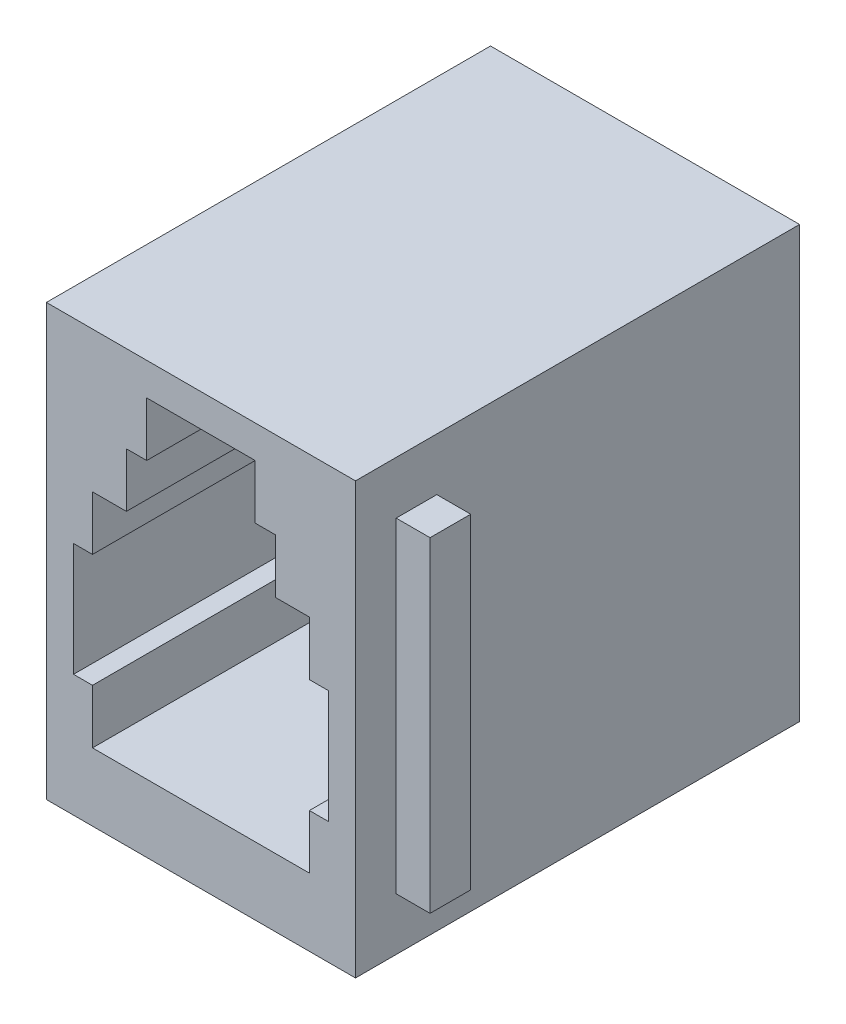
ISO-10303-21;
HEADER;
FILE_DESCRIPTION(('STEP AP214'),'2;1');
FILE_NAME('part.step','',(''),(''),'','','');
FILE_SCHEMA(('AUTOMOTIVE_DESIGN { 1 0 10303 214 1 1 1 1 }'));
ENDSEC;
DATA;
#1=APPLICATION_CONTEXT('core data for automotive mechanical design processes');
#2=APPLICATION_PROTOCOL_DEFINITION('international standard','automotive_design',2000,#1);
#3=PRODUCT_CONTEXT('',#1,'mechanical');
#4=PRODUCT('Part','Part','',(#3));
#5=PRODUCT_RELATED_PRODUCT_CATEGORY('part','',(#4));
#6=PRODUCT_DEFINITION_FORMATION('','',#4);
#7=PRODUCT_DEFINITION_CONTEXT('part definition',#1,'design');
#8=PRODUCT_DEFINITION('design','',#6,#7);
#9=PRODUCT_DEFINITION_SHAPE('','',#8);
#10=(LENGTH_UNIT() NAMED_UNIT(*) SI_UNIT(.MILLI.,.METRE.));
#11=(NAMED_UNIT(*) PLANE_ANGLE_UNIT() SI_UNIT($,.RADIAN.));
#12=(NAMED_UNIT(*) SI_UNIT($,.STERADIAN.) SOLID_ANGLE_UNIT());
#13=UNCERTAINTY_MEASURE_WITH_UNIT(LENGTH_MEASURE(1.E-05),#10,'distance_accuracy_value','');
#14=(GEOMETRIC_REPRESENTATION_CONTEXT(3) GLOBAL_UNCERTAINTY_ASSIGNED_CONTEXT((#13)) GLOBAL_UNIT_ASSIGNED_CONTEXT((#10,
#11,#12)) REPRESENTATION_CONTEXT('',''));
#15=CARTESIAN_POINT('',(0.,0.,0.));
#16=DIRECTION('',(0.,0.,1.));
#17=DIRECTION('',(1.,0.,0.));
#18=AXIS2_PLACEMENT_3D('',#15,#16,#17);
#19=CARTESIAN_POINT('',(-5.7,7.94,16.38));
#20=DIRECTION('',(1.,0.,0.));
#21=DIRECTION('',(0.,1.,0.));
#22=AXIS2_PLACEMENT_3D('',#19,#20,#21);
#23=PLANE('',#22);
#24=DIRECTION('',(0.,-1.,0.));
#25=VECTOR('',#24,1.);
#26=CARTESIAN_POINT('',(-5.69999999999999,6.,13.38));
#27=LINE('',#26,#25);
#28=CARTESIAN_POINT('',(-5.7,6.,13.38));
#29=VERTEX_POINT('',#28);
#30=CARTESIAN_POINT('',(-5.7,-6.,13.38));
#31=VERTEX_POINT('',#30);
#32=EDGE_CURVE('E49',#29,#31,#27,.T.);
#33=ORIENTED_EDGE('',*,*,#32,.F.);
#34=DIRECTION('',(0.,0.,-1.));
#35=VECTOR('',#34,1.);
#36=CARTESIAN_POINT('',(-5.69999999999999,6.,13.38));
#37=LINE('',#36,#35);
#38=CARTESIAN_POINT('',(-5.7,6.,14.88));
#39=VERTEX_POINT('',#38);
#40=EDGE_CURVE('E53',#39,#29,#37,.T.);
#41=ORIENTED_EDGE('',*,*,#40,.F.);
#42=DIRECTION('',(0.,-1.,0.));
#43=VECTOR('',#42,1.);
#44=CARTESIAN_POINT('',(-5.69999999999999,6.,14.88));
#45=LINE('',#44,#43);
#46=CARTESIAN_POINT('',(-5.69999999999999,-6.,14.88));
#47=VERTEX_POINT('',#46);
#48=EDGE_CURVE('E266',#39,#47,#45,.T.);
#49=ORIENTED_EDGE('',*,*,#48,.T.);
#50=DIRECTION('',(0.,0.,-1.));
#51=VECTOR('',#50,1.);
#52=CARTESIAN_POINT('',(-5.69999999999999,-6.,13.38));
#53=LINE('',#52,#51);
#54=EDGE_CURVE('E257',#47,#31,#53,.T.);
#55=ORIENTED_EDGE('',*,*,#54,.T.);
#56=EDGE_LOOP('',(#33,#41,#49,#55));
#57=FACE_BOUND('',#56,.T.);
#58=DIRECTION('',(0.,-1.,0.));
#59=VECTOR('',#58,1.);
#60=CARTESIAN_POINT('',(-5.7,7.94,0.));
#61=LINE('',#60,#59);
#62=CARTESIAN_POINT('',(-5.7,7.94,0.));
#63=VERTEX_POINT('',#62);
#64=CARTESIAN_POINT('',(-5.7,-7.94,0.));
#65=VERTEX_POINT('',#64);
#66=EDGE_CURVE('E437',#63,#65,#61,.T.);
#67=ORIENTED_EDGE('',*,*,#66,.T.);
#68=DIRECTION('',(0.,0.,-1.));
#69=VECTOR('',#68,1.);
#70=CARTESIAN_POINT('',(-5.7,-7.94,16.38));
#71=LINE('',#70,#69);
#72=CARTESIAN_POINT('',(-5.7,-7.94,16.38));
#73=VERTEX_POINT('',#72);
#74=EDGE_CURVE('E12',#73,#65,#71,.T.);
#75=ORIENTED_EDGE('',*,*,#74,.F.);
#76=DIRECTION('',(0.,-1.,0.));
#77=VECTOR('',#76,1.);
#78=CARTESIAN_POINT('',(-5.7,7.94,16.38));
#79=LINE('',#78,#77);
#80=CARTESIAN_POINT('',(-5.7,7.94,16.38));
#81=VERTEX_POINT('',#80);
#82=EDGE_CURVE('E438',#81,#73,#79,.T.);
#83=ORIENTED_EDGE('',*,*,#82,.F.);
#84=DIRECTION('',(0.,0.,-1.));
#85=VECTOR('',#84,1.);
#86=CARTESIAN_POINT('',(-5.7,7.94,16.38));
#87=LINE('',#86,#85);
#88=EDGE_CURVE('E448',#81,#63,#87,.T.);
#89=ORIENTED_EDGE('',*,*,#88,.T.);
#90=EDGE_LOOP('',(#67,#75,#83,#89));
#91=FACE_BOUND('',#90,.T.);
#92=ADVANCED_FACE('F35',(#57,#91),#23,.F.);
#93=CARTESIAN_POINT('',(-5.7,-7.94,16.38));
#94=DIRECTION('',(0.,1.,0.));
#95=DIRECTION('',(-1.,0.,0.));
#96=AXIS2_PLACEMENT_3D('',#93,#94,#95);
#97=PLANE('',#96);
#98=DIRECTION('',(1.,0.,0.));
#99=VECTOR('',#98,1.);
#100=CARTESIAN_POINT('',(-5.7,-7.94,0.));
#101=LINE('',#100,#99);
#102=CARTESIAN_POINT('',(5.7,-7.94,0.));
#103=VERTEX_POINT('',#102);
#104=EDGE_CURVE('E451',#65,#103,#101,.T.);
#105=ORIENTED_EDGE('',*,*,#104,.T.);
#106=DIRECTION('',(0.,0.,-1.));
#107=VECTOR('',#106,1.);
#108=CARTESIAN_POINT('',(5.7,-7.94,16.38));
#109=LINE('',#108,#107);
#110=CARTESIAN_POINT('',(5.7,-7.94,16.38));
#111=VERTEX_POINT('',#110);
#112=EDGE_CURVE('E42',#111,#103,#109,.T.);
#113=ORIENTED_EDGE('',*,*,#112,.F.);
#114=DIRECTION('',(1.,0.,0.));
#115=VECTOR('',#114,1.);
#116=CARTESIAN_POINT('',(-5.7,-7.94,16.38));
#117=LINE('',#116,#115);
#118=EDGE_CURVE('E441',#73,#111,#117,.T.);
#119=ORIENTED_EDGE('',*,*,#118,.F.);
#120=ORIENTED_EDGE('',*,*,#74,.T.);
#121=EDGE_LOOP('',(#105,#113,#119,#120));
#122=FACE_BOUND('',#121,.T.);
#123=ADVANCED_FACE('F481',(#122),#97,.F.);
#124=CARTESIAN_POINT('',(5.7,7.94,16.38));
#125=DIRECTION('',(-1.,0.,0.));
#126=DIRECTION('',(0.,-1.,0.));
#127=AXIS2_PLACEMENT_3D('',#124,#125,#126);
#128=PLANE('',#127);
#129=DIRECTION('',(0.,-1.,0.));
#130=VECTOR('',#129,1.);
#131=CARTESIAN_POINT('',(5.7,6.,14.88));
#132=LINE('',#131,#130);
#133=CARTESIAN_POINT('',(5.7,6.,14.88));
#134=VERTEX_POINT('',#133);
#135=CARTESIAN_POINT('',(5.7,-6.,14.88));
#136=VERTEX_POINT('',#135);
#137=EDGE_CURVE('E294',#134,#136,#132,.T.);
#138=ORIENTED_EDGE('',*,*,#137,.F.);
#139=DIRECTION('',(0.,0.,1.));
#140=VECTOR('',#139,1.);
#141=CARTESIAN_POINT('',(5.7,6.,13.38));
#142=LINE('',#141,#140);
#143=CARTESIAN_POINT('',(5.7,6.,13.38));
#144=VERTEX_POINT('',#143);
#145=EDGE_CURVE('E270',#144,#134,#142,.T.);
#146=ORIENTED_EDGE('',*,*,#145,.F.);
#147=DIRECTION('',(0.,-1.,0.));
#148=VECTOR('',#147,1.);
#149=CARTESIAN_POINT('',(5.7,6.,13.38));
#150=LINE('',#149,#148);
#151=CARTESIAN_POINT('',(5.7,-6.,13.38));
#152=VERTEX_POINT('',#151);
#153=EDGE_CURVE('E280',#144,#152,#150,.T.);
#154=ORIENTED_EDGE('',*,*,#153,.T.);
#155=DIRECTION('',(0.,0.,1.));
#156=VECTOR('',#155,1.);
#157=CARTESIAN_POINT('',(5.7,-6.,13.38));
#158=LINE('',#157,#156);
#159=EDGE_CURVE('E262',#152,#136,#158,.T.);
#160=ORIENTED_EDGE('',*,*,#159,.T.);
#161=EDGE_LOOP('',(#138,#146,#154,#160));
#162=FACE_BOUND('',#161,.T.);
#163=DIRECTION('',(0.,1.,0.));
#164=VECTOR('',#163,1.);
#165=CARTESIAN_POINT('',(5.7,7.94,0.));
#166=LINE('',#165,#164);
#167=CARTESIAN_POINT('',(5.7,7.94,0.));
#168=VERTEX_POINT('',#167);
#169=EDGE_CURVE('E453',#103,#168,#166,.T.);
#170=ORIENTED_EDGE('',*,*,#169,.T.);
#171=DIRECTION('',(0.,0.,-1.));
#172=VECTOR('',#171,1.);
#173=CARTESIAN_POINT('',(5.7,7.94,16.38));
#174=LINE('',#173,#172);
#175=CARTESIAN_POINT('',(5.7,7.94,16.38));
#176=VERTEX_POINT('',#175);
#177=EDGE_CURVE('E458',#176,#168,#174,.T.);
#178=ORIENTED_EDGE('',*,*,#177,.F.);
#179=DIRECTION('',(0.,1.,0.));
#180=VECTOR('',#179,1.);
#181=CARTESIAN_POINT('',(5.7,7.94,16.38));
#182=LINE('',#181,#180);
#183=EDGE_CURVE('E444',#111,#176,#182,.T.);
#184=ORIENTED_EDGE('',*,*,#183,.F.);
#185=ORIENTED_EDGE('',*,*,#112,.T.);
#186=EDGE_LOOP('',(#170,#178,#184,#185));
#187=FACE_BOUND('',#186,.T.);
#188=ADVANCED_FACE('F465',(#162,#187),#128,.F.);
#189=CARTESIAN_POINT('',(-5.7,7.94,16.38));
#190=DIRECTION('',(0.,-1.,0.));
#191=DIRECTION('',(1.,0.,0.));
#192=AXIS2_PLACEMENT_3D('',#189,#190,#191);
#193=PLANE('',#192);
#194=DIRECTION('',(-1.,0.,0.));
#195=VECTOR('',#194,1.);
#196=CARTESIAN_POINT('',(-5.7,7.94,0.));
#197=LINE('',#196,#195);
#198=EDGE_CURVE('E442',#168,#63,#197,.T.);
#199=ORIENTED_EDGE('',*,*,#198,.T.);
#200=ORIENTED_EDGE('',*,*,#88,.F.);
#201=DIRECTION('',(-1.,0.,0.));
#202=VECTOR('',#201,1.);
#203=CARTESIAN_POINT('',(-5.7,7.94,16.38));
#204=LINE('',#203,#202);
#205=EDGE_CURVE('E446',#176,#81,#204,.T.);
#206=ORIENTED_EDGE('',*,*,#205,.F.);
#207=ORIENTED_EDGE('',*,*,#177,.T.);
#208=EDGE_LOOP('',(#199,#200,#206,#207));
#209=FACE_BOUND('',#208,.T.);
#210=ADVANCED_FACE('F474',(#209),#193,.F.);
#211=CARTESIAN_POINT('',(0.,0.,16.38));
#212=DIRECTION('',(0.,0.,1.));
#213=DIRECTION('',(1.,0.,0.));
#214=AXIS2_PLACEMENT_3D('',#211,#212,#213);
#215=PLANE('',#214);
#216=DIRECTION('',(0.,1.,0.));
#217=VECTOR('',#216,1.);
#218=CARTESIAN_POINT('',(4.,2.74,16.38));
#219=LINE('',#218,#217);
#220=CARTESIAN_POINT('',(4.,0.740000000000001,16.38));
#221=VERTEX_POINT('',#220);
#222=CARTESIAN_POINT('',(4.,2.74,16.38));
#223=VERTEX_POINT('',#222);
#224=EDGE_CURVE('E297',#221,#223,#219,.T.);
#225=ORIENTED_EDGE('',*,*,#224,.F.);
#226=DIRECTION('',(-1.,0.,0.));
#227=VECTOR('',#226,1.);
#228=CARTESIAN_POINT('',(4.,0.740000000000001,16.38));
#229=LINE('',#228,#227);
#230=CARTESIAN_POINT('',(4.7,0.740000000000001,16.38));
#231=VERTEX_POINT('',#230);
#232=EDGE_CURVE('E393',#231,#221,#229,.T.);
#233=ORIENTED_EDGE('',*,*,#232,.F.);
#234=DIRECTION('',(0.,1.,0.));
#235=VECTOR('',#234,1.);
#236=CARTESIAN_POINT('',(4.7,0.740000000000001,16.38));
#237=LINE('',#236,#235);
#238=CARTESIAN_POINT('',(4.7,-3.44,16.38));
#239=VERTEX_POINT('',#238);
#240=EDGE_CURVE('E390',#239,#231,#237,.T.);
#241=ORIENTED_EDGE('',*,*,#240,.F.);
#242=DIRECTION('',(1.,0.,0.));
#243=VECTOR('',#242,1.);
#244=CARTESIAN_POINT('',(4.7,-3.44,16.38));
#245=LINE('',#244,#243);
#246=CARTESIAN_POINT('',(4.,-3.44,16.38));
#247=VERTEX_POINT('',#246);
#248=EDGE_CURVE('E387',#247,#239,#245,.T.);
#249=ORIENTED_EDGE('',*,*,#248,.F.);
#250=DIRECTION('',(0.,1.,0.));
#251=VECTOR('',#250,1.);
#252=CARTESIAN_POINT('',(4.,-3.44,16.38));
#253=LINE('',#252,#251);
#254=CARTESIAN_POINT('',(4.,-5.44,16.38));
#255=VERTEX_POINT('',#254);
#256=EDGE_CURVE('E384',#255,#247,#253,.T.);
#257=ORIENTED_EDGE('',*,*,#256,.F.);
#258=DIRECTION('',(1.,0.,0.));
#259=VECTOR('',#258,1.);
#260=CARTESIAN_POINT('',(4.,-5.44,16.38));
#261=LINE('',#260,#259);
#262=CARTESIAN_POINT('',(-4.,-5.44,16.38));
#263=VERTEX_POINT('',#262);
#264=EDGE_CURVE('E381',#263,#255,#261,.T.);
#265=ORIENTED_EDGE('',*,*,#264,.F.);
#266=DIRECTION('',(0.,-1.,0.));
#267=VECTOR('',#266,1.);
#268=CARTESIAN_POINT('',(-4.,-3.44,16.38));
#269=LINE('',#268,#267);
#270=CARTESIAN_POINT('',(-4.,-3.44,16.38));
#271=VERTEX_POINT('',#270);
#272=EDGE_CURVE('E378',#271,#263,#269,.T.);
#273=ORIENTED_EDGE('',*,*,#272,.F.);
#274=DIRECTION('',(1.,0.,0.));
#275=VECTOR('',#274,1.);
#276=CARTESIAN_POINT('',(-4.7,-3.44,16.38));
#277=LINE('',#276,#275);
#278=CARTESIAN_POINT('',(-4.7,-3.44,16.38));
#279=VERTEX_POINT('',#278);
#280=EDGE_CURVE('E375',#279,#271,#277,.T.);
#281=ORIENTED_EDGE('',*,*,#280,.F.);
#282=DIRECTION('',(0.,-1.,0.));
#283=VECTOR('',#282,1.);
#284=CARTESIAN_POINT('',(-4.7,0.740000000000001,16.38));
#285=LINE('',#284,#283);
#286=CARTESIAN_POINT('',(-4.7,0.740000000000001,16.38));
#287=VERTEX_POINT('',#286);
#288=EDGE_CURVE('E372',#287,#279,#285,.T.);
#289=ORIENTED_EDGE('',*,*,#288,.F.);
#290=DIRECTION('',(-1.,0.,0.));
#291=VECTOR('',#290,1.);
#292=CARTESIAN_POINT('',(-4.,0.740000000000001,16.38));
#293=LINE('',#292,#291);
#294=CARTESIAN_POINT('',(-4.,0.740000000000001,16.38));
#295=VERTEX_POINT('',#294);
#296=EDGE_CURVE('E369',#295,#287,#293,.T.);
#297=ORIENTED_EDGE('',*,*,#296,.F.);
#298=DIRECTION('',(0.,-1.,0.));
#299=VECTOR('',#298,1.);
#300=CARTESIAN_POINT('',(-4.,2.74,16.38));
#301=LINE('',#300,#299);
#302=CARTESIAN_POINT('',(-4.,2.74,16.38));
#303=VERTEX_POINT('',#302);
#304=EDGE_CURVE('E366',#303,#295,#301,.T.);
#305=ORIENTED_EDGE('',*,*,#304,.F.);
#306=DIRECTION('',(-1.,0.,0.));
#307=VECTOR('',#306,1.);
#308=CARTESIAN_POINT('',(-2.75,2.74,16.38));
#309=LINE('',#308,#307);
#310=CARTESIAN_POINT('',(-2.75,2.74,16.38));
#311=VERTEX_POINT('',#310);
#312=EDGE_CURVE('E363',#311,#303,#309,.T.);
#313=ORIENTED_EDGE('',*,*,#312,.F.);
#314=DIRECTION('',(0.,-1.,0.));
#315=VECTOR('',#314,1.);
#316=CARTESIAN_POINT('',(-2.75,4.74,16.38));
#317=LINE('',#316,#315);
#318=CARTESIAN_POINT('',(-2.75,4.74,16.38));
#319=VERTEX_POINT('',#318);
#320=EDGE_CURVE('E360',#319,#311,#317,.T.);
#321=ORIENTED_EDGE('',*,*,#320,.F.);
#322=DIRECTION('',(-1.,0.,0.));
#323=VECTOR('',#322,1.);
#324=CARTESIAN_POINT('',(-2.,4.74,16.38));
#325=LINE('',#324,#323);
#326=CARTESIAN_POINT('',(-2.,4.74,16.38));
#327=VERTEX_POINT('',#326);
#328=EDGE_CURVE('E357',#327,#319,#325,.T.);
#329=ORIENTED_EDGE('',*,*,#328,.F.);
#330=DIRECTION('',(0.,-1.,0.));
#331=VECTOR('',#330,1.);
#332=CARTESIAN_POINT('',(-2.,6.74,16.38));
#333=LINE('',#332,#331);
#334=CARTESIAN_POINT('',(-2.,6.74,16.38));
#335=VERTEX_POINT('',#334);
#336=EDGE_CURVE('E354',#335,#327,#333,.T.);
#337=ORIENTED_EDGE('',*,*,#336,.F.);
#338=DIRECTION('',(-1.,0.,0.));
#339=VECTOR('',#338,1.);
#340=CARTESIAN_POINT('',(-2.,6.74,16.38));
#341=LINE('',#340,#339);
#342=CARTESIAN_POINT('',(2.,6.74,16.38));
#343=VERTEX_POINT('',#342);
#344=EDGE_CURVE('E351',#343,#335,#341,.T.);
#345=ORIENTED_EDGE('',*,*,#344,.F.);
#346=DIRECTION('',(0.,1.,0.));
#347=VECTOR('',#346,1.);
#348=CARTESIAN_POINT('',(2.,6.74,16.38));
#349=LINE('',#348,#347);
#350=CARTESIAN_POINT('',(2.,4.74,16.38));
#351=VERTEX_POINT('',#350);
#352=EDGE_CURVE('E348',#351,#343,#349,.T.);
#353=ORIENTED_EDGE('',*,*,#352,.F.);
#354=DIRECTION('',(-1.,0.,0.));
#355=VECTOR('',#354,1.);
#356=CARTESIAN_POINT('',(2.,4.74,16.38));
#357=LINE('',#356,#355);
#358=CARTESIAN_POINT('',(2.75,4.74,16.38));
#359=VERTEX_POINT('',#358);
#360=EDGE_CURVE('E345',#359,#351,#357,.T.);
#361=ORIENTED_EDGE('',*,*,#360,.F.);
#362=DIRECTION('',(0.,1.,0.));
#363=VECTOR('',#362,1.);
#364=CARTESIAN_POINT('',(2.75,4.74,16.38));
#365=LINE('',#364,#363);
#366=CARTESIAN_POINT('',(2.75,2.74,16.38));
#367=VERTEX_POINT('',#366);
#368=EDGE_CURVE('E342',#367,#359,#365,.T.);
#369=ORIENTED_EDGE('',*,*,#368,.F.);
#370=DIRECTION('',(-1.,0.,0.));
#371=VECTOR('',#370,1.);
#372=CARTESIAN_POINT('',(2.75,2.74,16.38));
#373=LINE('',#372,#371);
#374=EDGE_CURVE('E339',#223,#367,#373,.T.);
#375=ORIENTED_EDGE('',*,*,#374,.F.);
#376=EDGE_LOOP('',(#225,#233,#241,#249,#257,#265,#273,#281,#289,#297,#305,#313,#321,#329,#337,
#345,#353,#361,#369,#375));
#377=FACE_BOUND('',#376,.T.);
#378=ORIENTED_EDGE('',*,*,#82,.T.);
#379=ORIENTED_EDGE('',*,*,#118,.T.);
#380=ORIENTED_EDGE('',*,*,#183,.T.);
#381=ORIENTED_EDGE('',*,*,#205,.T.);
#382=EDGE_LOOP('',(#378,#379,#380,#381));
#383=FACE_BOUND('',#382,.T.);
#384=ADVANCED_FACE('F480',(#377,#383),#215,.T.);
#385=CARTESIAN_POINT('',(0.,0.,0.));
#386=DIRECTION('',(0.,0.,1.));
#387=DIRECTION('',(1.,0.,0.));
#388=AXIS2_PLACEMENT_3D('',#385,#386,#387);
#389=PLANE('',#388);
#390=ORIENTED_EDGE('',*,*,#66,.F.);
#391=ORIENTED_EDGE('',*,*,#198,.F.);
#392=ORIENTED_EDGE('',*,*,#169,.F.);
#393=ORIENTED_EDGE('',*,*,#104,.F.);
#394=EDGE_LOOP('',(#390,#391,#392,#393));
#395=FACE_BOUND('',#394,.T.);
#396=ADVANCED_FACE('F471',(#395),#389,.F.);
#397=CARTESIAN_POINT('',(4.,2.74,-15.3854606690863));
#398=DIRECTION('',(1.,0.,0.));
#399=DIRECTION('',(0.,1.,0.));
#400=AXIS2_PLACEMENT_3D('',#397,#398,#399);
#401=PLANE('',#400);
#402=DIRECTION('',(0.,-1.,0.));
#403=VECTOR('',#402,1.);
#404=CARTESIAN_POINT('',(4.,2.74,1.));
#405=LINE('',#404,#403);
#406=CARTESIAN_POINT('',(4.,2.74,1.));
#407=VERTEX_POINT('',#406);
#408=CARTESIAN_POINT('',(4.,0.740000000000001,1.));
#409=VERTEX_POINT('',#408);
#410=EDGE_CURVE('E335',#407,#409,#405,.T.);
#411=ORIENTED_EDGE('',*,*,#410,.T.);
#412=DIRECTION('',(0.,0.,1.));
#413=VECTOR('',#412,1.);
#414=CARTESIAN_POINT('',(4.,0.740000000000001,-15.3854606690863));
#415=LINE('',#414,#413);
#416=EDGE_CURVE('E301',#409,#221,#415,.T.);
#417=ORIENTED_EDGE('',*,*,#416,.T.);
#418=ORIENTED_EDGE('',*,*,#224,.T.);
#419=DIRECTION('',(0.,0.,1.));
#420=VECTOR('',#419,1.);
#421=CARTESIAN_POINT('',(4.,2.74,-15.3854606690863));
#422=LINE('',#421,#420);
#423=EDGE_CURVE('E396',#407,#223,#422,.T.);
#424=ORIENTED_EDGE('',*,*,#423,.F.);
#425=EDGE_LOOP('',(#411,#417,#418,#424));
#426=FACE_BOUND('',#425,.T.);
#427=ADVANCED_FACE('F494',(#426),#401,.F.);
#428=CARTESIAN_POINT('',(4.,0.740000000000001,-15.3854606690863));
#429=DIRECTION('',(0.,1.,0.));
#430=DIRECTION('',(0.,0.,1.));
#431=AXIS2_PLACEMENT_3D('',#428,#429,#430);
#432=PLANE('',#431);
#433=DIRECTION('',(1.,0.,0.));
#434=VECTOR('',#433,1.);
#435=CARTESIAN_POINT('',(4.,0.740000000000001,1.));
#436=LINE('',#435,#434);
#437=CARTESIAN_POINT('',(4.7,0.740000000000001,1.));
#438=VERTEX_POINT('',#437);
#439=EDGE_CURVE('E333',#409,#438,#436,.T.);
#440=ORIENTED_EDGE('',*,*,#439,.T.);
#441=DIRECTION('',(0.,0.,1.));
#442=VECTOR('',#441,1.);
#443=CARTESIAN_POINT('',(4.7,0.740000000000001,-15.3854606690863));
#444=LINE('',#443,#442);
#445=EDGE_CURVE('E398',#438,#231,#444,.T.);
#446=ORIENTED_EDGE('',*,*,#445,.T.);
#447=ORIENTED_EDGE('',*,*,#232,.T.);
#448=ORIENTED_EDGE('',*,*,#416,.F.);
#449=EDGE_LOOP('',(#440,#446,#447,#448));
#450=FACE_BOUND('',#449,.T.);
#451=ADVANCED_FACE('F500',(#450),#432,.F.);
#452=CARTESIAN_POINT('',(4.7,0.740000000000001,-15.3854606690863));
#453=DIRECTION('',(1.,0.,0.));
#454=DIRECTION('',(0.,1.,0.));
#455=AXIS2_PLACEMENT_3D('',#452,#453,#454);
#456=PLANE('',#455);
#457=DIRECTION('',(0.,-1.,0.));
#458=VECTOR('',#457,1.);
#459=CARTESIAN_POINT('',(4.7,0.740000000000001,1.));
#460=LINE('',#459,#458);
#461=CARTESIAN_POINT('',(4.7,-3.44,1.));
#462=VERTEX_POINT('',#461);
#463=EDGE_CURVE('E331',#438,#462,#460,.T.);
#464=ORIENTED_EDGE('',*,*,#463,.T.);
#465=DIRECTION('',(0.,0.,1.));
#466=VECTOR('',#465,1.);
#467=CARTESIAN_POINT('',(4.7,-3.44,-15.3854606690863));
#468=LINE('',#467,#466);
#469=EDGE_CURVE('E400',#462,#239,#468,.T.);
#470=ORIENTED_EDGE('',*,*,#469,.T.);
#471=ORIENTED_EDGE('',*,*,#240,.T.);
#472=ORIENTED_EDGE('',*,*,#445,.F.);
#473=EDGE_LOOP('',(#464,#470,#471,#472));
#474=FACE_BOUND('',#473,.T.);
#475=ADVANCED_FACE('F570',(#474),#456,.F.);
#476=CARTESIAN_POINT('',(4.7,-3.44,-15.3854606690863));
#477=DIRECTION('',(0.,-1.,0.));
#478=DIRECTION('',(0.,0.,-1.));
#479=AXIS2_PLACEMENT_3D('',#476,#477,#478);
#480=PLANE('',#479);
#481=DIRECTION('',(-1.,0.,0.));
#482=VECTOR('',#481,1.);
#483=CARTESIAN_POINT('',(4.7,-3.44,1.));
#484=LINE('',#483,#482);
#485=CARTESIAN_POINT('',(4.,-3.44,1.));
#486=VERTEX_POINT('',#485);
#487=EDGE_CURVE('E329',#462,#486,#484,.T.);
#488=ORIENTED_EDGE('',*,*,#487,.T.);
#489=DIRECTION('',(0.,0.,1.));
#490=VECTOR('',#489,1.);
#491=CARTESIAN_POINT('',(4.,-3.44,-15.3854606690863));
#492=LINE('',#491,#490);
#493=EDGE_CURVE('E402',#486,#247,#492,.T.);
#494=ORIENTED_EDGE('',*,*,#493,.T.);
#495=ORIENTED_EDGE('',*,*,#248,.T.);
#496=ORIENTED_EDGE('',*,*,#469,.F.);
#497=EDGE_LOOP('',(#488,#494,#495,#496));
#498=FACE_BOUND('',#497,.T.);
#499=ADVANCED_FACE('F566',(#498),#480,.F.);
#500=CARTESIAN_POINT('',(4.,-3.44,-15.3854606690863));
#501=DIRECTION('',(1.,0.,0.));
#502=DIRECTION('',(0.,1.,0.));
#503=AXIS2_PLACEMENT_3D('',#500,#501,#502);
#504=PLANE('',#503);
#505=DIRECTION('',(0.,-1.,0.));
#506=VECTOR('',#505,1.);
#507=CARTESIAN_POINT('',(4.,-3.44,1.));
#508=LINE('',#507,#506);
#509=CARTESIAN_POINT('',(4.,-5.44,1.));
#510=VERTEX_POINT('',#509);
#511=EDGE_CURVE('E327',#486,#510,#508,.T.);
#512=ORIENTED_EDGE('',*,*,#511,.T.);
#513=DIRECTION('',(0.,0.,1.));
#514=VECTOR('',#513,1.);
#515=CARTESIAN_POINT('',(4.,-5.44,-15.3854606690863));
#516=LINE('',#515,#514);
#517=EDGE_CURVE('E404',#510,#255,#516,.T.);
#518=ORIENTED_EDGE('',*,*,#517,.T.);
#519=ORIENTED_EDGE('',*,*,#256,.T.);
#520=ORIENTED_EDGE('',*,*,#493,.F.);
#521=EDGE_LOOP('',(#512,#518,#519,#520));
#522=FACE_BOUND('',#521,.T.);
#523=ADVANCED_FACE('F562',(#522),#504,.F.);
#524=CARTESIAN_POINT('',(4.,-5.44,-15.3854606690863));
#525=DIRECTION('',(0.,-1.,0.));
#526=DIRECTION('',(0.,0.,-1.));
#527=AXIS2_PLACEMENT_3D('',#524,#525,#526);
#528=PLANE('',#527);
#529=DIRECTION('',(-1.,0.,0.));
#530=VECTOR('',#529,1.);
#531=CARTESIAN_POINT('',(4.,-5.44,1.));
#532=LINE('',#531,#530);
#533=CARTESIAN_POINT('',(-4.,-5.44,1.));
#534=VERTEX_POINT('',#533);
#535=EDGE_CURVE('E325',#510,#534,#532,.T.);
#536=ORIENTED_EDGE('',*,*,#535,.T.);
#537=DIRECTION('',(0.,0.,1.));
#538=VECTOR('',#537,1.);
#539=CARTESIAN_POINT('',(-4.,-5.44,-15.3854606690863));
#540=LINE('',#539,#538);
#541=EDGE_CURVE('E406',#534,#263,#540,.T.);
#542=ORIENTED_EDGE('',*,*,#541,.T.);
#543=ORIENTED_EDGE('',*,*,#264,.T.);
#544=ORIENTED_EDGE('',*,*,#517,.F.);
#545=EDGE_LOOP('',(#536,#542,#543,#544));
#546=FACE_BOUND('',#545,.T.);
#547=ADVANCED_FACE('F558',(#546),#528,.F.);
#548=CARTESIAN_POINT('',(-4.,-3.44,-15.3854606690863));
#549=DIRECTION('',(-1.,0.,0.));
#550=DIRECTION('',(0.,-1.,0.));
#551=AXIS2_PLACEMENT_3D('',#548,#549,#550);
#552=PLANE('',#551);
#553=DIRECTION('',(0.,1.,0.));
#554=VECTOR('',#553,1.);
#555=CARTESIAN_POINT('',(-4.,-3.44,1.));
#556=LINE('',#555,#554);
#557=CARTESIAN_POINT('',(-4.,-3.44,1.));
#558=VERTEX_POINT('',#557);
#559=EDGE_CURVE('E323',#534,#558,#556,.T.);
#560=ORIENTED_EDGE('',*,*,#559,.T.);
#561=DIRECTION('',(0.,0.,1.));
#562=VECTOR('',#561,1.);
#563=CARTESIAN_POINT('',(-4.,-3.44,-15.3854606690863));
#564=LINE('',#563,#562);
#565=EDGE_CURVE('E408',#558,#271,#564,.T.);
#566=ORIENTED_EDGE('',*,*,#565,.T.);
#567=ORIENTED_EDGE('',*,*,#272,.T.);
#568=ORIENTED_EDGE('',*,*,#541,.F.);
#569=EDGE_LOOP('',(#560,#566,#567,#568));
#570=FACE_BOUND('',#569,.T.);
#571=ADVANCED_FACE('F554',(#570),#552,.F.);
#572=CARTESIAN_POINT('',(-4.7,-3.44,-15.3854606690863));
#573=DIRECTION('',(0.,-1.,0.));
#574=DIRECTION('',(0.,0.,-1.));
#575=AXIS2_PLACEMENT_3D('',#572,#573,#574);
#576=PLANE('',#575);
#577=DIRECTION('',(-1.,0.,0.));
#578=VECTOR('',#577,1.);
#579=CARTESIAN_POINT('',(-4.7,-3.44,1.));
#580=LINE('',#579,#578);
#581=CARTESIAN_POINT('',(-4.7,-3.44,1.));
#582=VERTEX_POINT('',#581);
#583=EDGE_CURVE('E321',#558,#582,#580,.T.);
#584=ORIENTED_EDGE('',*,*,#583,.T.);
#585=DIRECTION('',(0.,0.,1.));
#586=VECTOR('',#585,1.);
#587=CARTESIAN_POINT('',(-4.7,-3.44,-15.3854606690863));
#588=LINE('',#587,#586);
#589=EDGE_CURVE('E410',#582,#279,#588,.T.);
#590=ORIENTED_EDGE('',*,*,#589,.T.);
#591=ORIENTED_EDGE('',*,*,#280,.T.);
#592=ORIENTED_EDGE('',*,*,#565,.F.);
#593=EDGE_LOOP('',(#584,#590,#591,#592));
#594=FACE_BOUND('',#593,.T.);
#595=ADVANCED_FACE('F550',(#594),#576,.F.);
#596=CARTESIAN_POINT('',(-4.7,0.740000000000001,-15.3854606690863));
#597=DIRECTION('',(-1.,0.,0.));
#598=DIRECTION('',(0.,-1.,0.));
#599=AXIS2_PLACEMENT_3D('',#596,#597,#598);
#600=PLANE('',#599);
#601=DIRECTION('',(0.,1.,0.));
#602=VECTOR('',#601,1.);
#603=CARTESIAN_POINT('',(-4.7,0.740000000000001,1.));
#604=LINE('',#603,#602);
#605=CARTESIAN_POINT('',(-4.7,0.740000000000001,1.));
#606=VERTEX_POINT('',#605);
#607=EDGE_CURVE('E319',#582,#606,#604,.T.);
#608=ORIENTED_EDGE('',*,*,#607,.T.);
#609=DIRECTION('',(0.,0.,1.));
#610=VECTOR('',#609,1.);
#611=CARTESIAN_POINT('',(-4.7,0.740000000000001,-15.3854606690863));
#612=LINE('',#611,#610);
#613=EDGE_CURVE('E412',#606,#287,#612,.T.);
#614=ORIENTED_EDGE('',*,*,#613,.T.);
#615=ORIENTED_EDGE('',*,*,#288,.T.);
#616=ORIENTED_EDGE('',*,*,#589,.F.);
#617=EDGE_LOOP('',(#608,#614,#615,#616));
#618=FACE_BOUND('',#617,.T.);
#619=ADVANCED_FACE('F546',(#618),#600,.F.);
#620=CARTESIAN_POINT('',(-4.,0.740000000000001,-15.3854606690863));
#621=DIRECTION('',(0.,1.,0.));
#622=DIRECTION('',(0.,0.,1.));
#623=AXIS2_PLACEMENT_3D('',#620,#621,#622);
#624=PLANE('',#623);
#625=DIRECTION('',(1.,0.,0.));
#626=VECTOR('',#625,1.);
#627=CARTESIAN_POINT('',(-4.,0.740000000000001,1.));
#628=LINE('',#627,#626);
#629=CARTESIAN_POINT('',(-4.,0.740000000000001,1.));
#630=VERTEX_POINT('',#629);
#631=EDGE_CURVE('E317',#606,#630,#628,.T.);
#632=ORIENTED_EDGE('',*,*,#631,.T.);
#633=DIRECTION('',(0.,0.,1.));
#634=VECTOR('',#633,1.);
#635=CARTESIAN_POINT('',(-4.,0.740000000000001,-15.3854606690863));
#636=LINE('',#635,#634);
#637=EDGE_CURVE('E414',#630,#295,#636,.T.);
#638=ORIENTED_EDGE('',*,*,#637,.T.);
#639=ORIENTED_EDGE('',*,*,#296,.T.);
#640=ORIENTED_EDGE('',*,*,#613,.F.);
#641=EDGE_LOOP('',(#632,#638,#639,#640));
#642=FACE_BOUND('',#641,.T.);
#643=ADVANCED_FACE('F542',(#642),#624,.F.);
#644=CARTESIAN_POINT('',(-4.,2.74,-15.3854606690863));
#645=DIRECTION('',(-1.,0.,0.));
#646=DIRECTION('',(0.,-1.,0.));
#647=AXIS2_PLACEMENT_3D('',#644,#645,#646);
#648=PLANE('',#647);
#649=DIRECTION('',(0.,1.,0.));
#650=VECTOR('',#649,1.);
#651=CARTESIAN_POINT('',(-4.,2.74,1.));
#652=LINE('',#651,#650);
#653=CARTESIAN_POINT('',(-4.,2.74,1.));
#654=VERTEX_POINT('',#653);
#655=EDGE_CURVE('E315',#630,#654,#652,.T.);
#656=ORIENTED_EDGE('',*,*,#655,.T.);
#657=DIRECTION('',(0.,0.,1.));
#658=VECTOR('',#657,1.);
#659=CARTESIAN_POINT('',(-4.,2.74,-15.3854606690863));
#660=LINE('',#659,#658);
#661=EDGE_CURVE('E416',#654,#303,#660,.T.);
#662=ORIENTED_EDGE('',*,*,#661,.T.);
#663=ORIENTED_EDGE('',*,*,#304,.T.);
#664=ORIENTED_EDGE('',*,*,#637,.F.);
#665=EDGE_LOOP('',(#656,#662,#663,#664));
#666=FACE_BOUND('',#665,.T.);
#667=ADVANCED_FACE('F538',(#666),#648,.F.);
#668=CARTESIAN_POINT('',(-2.75,2.74,-15.3854606690863));
#669=DIRECTION('',(0.,1.,0.));
#670=DIRECTION('',(0.,0.,1.));
#671=AXIS2_PLACEMENT_3D('',#668,#669,#670);
#672=PLANE('',#671);
#673=DIRECTION('',(1.,0.,0.));
#674=VECTOR('',#673,1.);
#675=CARTESIAN_POINT('',(-2.75,2.74,1.));
#676=LINE('',#675,#674);
#677=CARTESIAN_POINT('',(-2.75,2.74,1.));
#678=VERTEX_POINT('',#677);
#679=EDGE_CURVE('E313',#654,#678,#676,.T.);
#680=ORIENTED_EDGE('',*,*,#679,.T.);
#681=DIRECTION('',(0.,0.,1.));
#682=VECTOR('',#681,1.);
#683=CARTESIAN_POINT('',(-2.75,2.74,-15.3854606690863));
#684=LINE('',#683,#682);
#685=EDGE_CURVE('E418',#678,#311,#684,.T.);
#686=ORIENTED_EDGE('',*,*,#685,.T.);
#687=ORIENTED_EDGE('',*,*,#312,.T.);
#688=ORIENTED_EDGE('',*,*,#661,.F.);
#689=EDGE_LOOP('',(#680,#686,#687,#688));
#690=FACE_BOUND('',#689,.T.);
#691=ADVANCED_FACE('F534',(#690),#672,.F.);
#692=CARTESIAN_POINT('',(-2.75,4.74,-15.3854606690863));
#693=DIRECTION('',(-1.,0.,0.));
#694=DIRECTION('',(0.,-1.,0.));
#695=AXIS2_PLACEMENT_3D('',#692,#693,#694);
#696=PLANE('',#695);
#697=DIRECTION('',(0.,1.,0.));
#698=VECTOR('',#697,1.);
#699=CARTESIAN_POINT('',(-2.75,4.74,1.));
#700=LINE('',#699,#698);
#701=CARTESIAN_POINT('',(-2.75,4.74,1.));
#702=VERTEX_POINT('',#701);
#703=EDGE_CURVE('E311',#678,#702,#700,.T.);
#704=ORIENTED_EDGE('',*,*,#703,.T.);
#705=DIRECTION('',(0.,0.,1.));
#706=VECTOR('',#705,1.);
#707=CARTESIAN_POINT('',(-2.75,4.74,-15.3854606690863));
#708=LINE('',#707,#706);
#709=EDGE_CURVE('E420',#702,#319,#708,.T.);
#710=ORIENTED_EDGE('',*,*,#709,.T.);
#711=ORIENTED_EDGE('',*,*,#320,.T.);
#712=ORIENTED_EDGE('',*,*,#685,.F.);
#713=EDGE_LOOP('',(#704,#710,#711,#712));
#714=FACE_BOUND('',#713,.T.);
#715=ADVANCED_FACE('F530',(#714),#696,.F.);
#716=CARTESIAN_POINT('',(-2.,4.74,-15.3854606690863));
#717=DIRECTION('',(0.,1.,0.));
#718=DIRECTION('',(0.,0.,1.));
#719=AXIS2_PLACEMENT_3D('',#716,#717,#718);
#720=PLANE('',#719);
#721=DIRECTION('',(1.,0.,0.));
#722=VECTOR('',#721,1.);
#723=CARTESIAN_POINT('',(-2.,4.74,1.));
#724=LINE('',#723,#722);
#725=CARTESIAN_POINT('',(-2.,4.74,1.));
#726=VERTEX_POINT('',#725);
#727=EDGE_CURVE('E309',#702,#726,#724,.T.);
#728=ORIENTED_EDGE('',*,*,#727,.T.);
#729=DIRECTION('',(0.,0.,1.));
#730=VECTOR('',#729,1.);
#731=CARTESIAN_POINT('',(-2.,4.74,-15.3854606690863));
#732=LINE('',#731,#730);
#733=EDGE_CURVE('E422',#726,#327,#732,.T.);
#734=ORIENTED_EDGE('',*,*,#733,.T.);
#735=ORIENTED_EDGE('',*,*,#328,.T.);
#736=ORIENTED_EDGE('',*,*,#709,.F.);
#737=EDGE_LOOP('',(#728,#734,#735,#736));
#738=FACE_BOUND('',#737,.T.);
#739=ADVANCED_FACE('F526',(#738),#720,.F.);
#740=CARTESIAN_POINT('',(-2.,6.74,-15.3854606690863));
#741=DIRECTION('',(-1.,0.,0.));
#742=DIRECTION('',(0.,-1.,0.));
#743=AXIS2_PLACEMENT_3D('',#740,#741,#742);
#744=PLANE('',#743);
#745=DIRECTION('',(0.,1.,0.));
#746=VECTOR('',#745,1.);
#747=CARTESIAN_POINT('',(-2.,6.74,1.));
#748=LINE('',#747,#746);
#749=CARTESIAN_POINT('',(-2.,6.74,1.));
#750=VERTEX_POINT('',#749);
#751=EDGE_CURVE('E307',#726,#750,#748,.T.);
#752=ORIENTED_EDGE('',*,*,#751,.T.);
#753=DIRECTION('',(0.,0.,1.));
#754=VECTOR('',#753,1.);
#755=CARTESIAN_POINT('',(-2.,6.74,-15.3854606690863));
#756=LINE('',#755,#754);
#757=EDGE_CURVE('E424',#750,#335,#756,.T.);
#758=ORIENTED_EDGE('',*,*,#757,.T.);
#759=ORIENTED_EDGE('',*,*,#336,.T.);
#760=ORIENTED_EDGE('',*,*,#733,.F.);
#761=EDGE_LOOP('',(#752,#758,#759,#760));
#762=FACE_BOUND('',#761,.T.);
#763=ADVANCED_FACE('F522',(#762),#744,.F.);
#764=CARTESIAN_POINT('',(-2.,6.74,-15.3854606690863));
#765=DIRECTION('',(0.,1.,0.));
#766=DIRECTION('',(0.,0.,1.));
#767=AXIS2_PLACEMENT_3D('',#764,#765,#766);
#768=PLANE('',#767);
#769=DIRECTION('',(1.,0.,0.));
#770=VECTOR('',#769,1.);
#771=CARTESIAN_POINT('',(-2.,6.74,1.));
#772=LINE('',#771,#770);
#773=CARTESIAN_POINT('',(2.,6.74,1.));
#774=VERTEX_POINT('',#773);
#775=EDGE_CURVE('E305',#750,#774,#772,.T.);
#776=ORIENTED_EDGE('',*,*,#775,.T.);
#777=DIRECTION('',(0.,0.,1.));
#778=VECTOR('',#777,1.);
#779=CARTESIAN_POINT('',(2.,6.74,-15.3854606690863));
#780=LINE('',#779,#778);
#781=EDGE_CURVE('E426',#774,#343,#780,.T.);
#782=ORIENTED_EDGE('',*,*,#781,.T.);
#783=ORIENTED_EDGE('',*,*,#344,.T.);
#784=ORIENTED_EDGE('',*,*,#757,.F.);
#785=EDGE_LOOP('',(#776,#782,#783,#784));
#786=FACE_BOUND('',#785,.T.);
#787=ADVANCED_FACE('F518',(#786),#768,.F.);
#788=CARTESIAN_POINT('',(2.,6.74,-15.3854606690863));
#789=DIRECTION('',(1.,0.,0.));
#790=DIRECTION('',(0.,1.,0.));
#791=AXIS2_PLACEMENT_3D('',#788,#789,#790);
#792=PLANE('',#791);
#793=DIRECTION('',(0.,-1.,0.));
#794=VECTOR('',#793,1.);
#795=CARTESIAN_POINT('',(2.,6.74,1.));
#796=LINE('',#795,#794);
#797=CARTESIAN_POINT('',(2.,4.74,1.));
#798=VERTEX_POINT('',#797);
#799=EDGE_CURVE('E303',#774,#798,#796,.T.);
#800=ORIENTED_EDGE('',*,*,#799,.T.);
#801=DIRECTION('',(0.,0.,1.));
#802=VECTOR('',#801,1.);
#803=CARTESIAN_POINT('',(2.,4.74,-15.3854606690863));
#804=LINE('',#803,#802);
#805=EDGE_CURVE('E428',#798,#351,#804,.T.);
#806=ORIENTED_EDGE('',*,*,#805,.T.);
#807=ORIENTED_EDGE('',*,*,#352,.T.);
#808=ORIENTED_EDGE('',*,*,#781,.F.);
#809=EDGE_LOOP('',(#800,#806,#807,#808));
#810=FACE_BOUND('',#809,.T.);
#811=ADVANCED_FACE('F514',(#810),#792,.F.);
#812=CARTESIAN_POINT('',(2.,4.74,-15.3854606690863));
#813=DIRECTION('',(0.,1.,0.));
#814=DIRECTION('',(0.,0.,1.));
#815=AXIS2_PLACEMENT_3D('',#812,#813,#814);
#816=PLANE('',#815);
#817=DIRECTION('',(1.,0.,0.));
#818=VECTOR('',#817,1.);
#819=CARTESIAN_POINT('',(2.,4.74,1.));
#820=LINE('',#819,#818);
#821=CARTESIAN_POINT('',(2.75,4.74,1.));
#822=VERTEX_POINT('',#821);
#823=EDGE_CURVE('E300',#798,#822,#820,.T.);
#824=ORIENTED_EDGE('',*,*,#823,.T.);
#825=DIRECTION('',(0.,0.,1.));
#826=VECTOR('',#825,1.);
#827=CARTESIAN_POINT('',(2.75,4.74,-15.3854606690863));
#828=LINE('',#827,#826);
#829=EDGE_CURVE('E430',#822,#359,#828,.T.);
#830=ORIENTED_EDGE('',*,*,#829,.T.);
#831=ORIENTED_EDGE('',*,*,#360,.T.);
#832=ORIENTED_EDGE('',*,*,#805,.F.);
#833=EDGE_LOOP('',(#824,#830,#831,#832));
#834=FACE_BOUND('',#833,.T.);
#835=ADVANCED_FACE('F510',(#834),#816,.F.);
#836=CARTESIAN_POINT('',(2.75,4.74,-15.3854606690863));
#837=DIRECTION('',(1.,0.,0.));
#838=DIRECTION('',(0.,1.,0.));
#839=AXIS2_PLACEMENT_3D('',#836,#837,#838);
#840=PLANE('',#839);
#841=DIRECTION('',(0.,-1.,0.));
#842=VECTOR('',#841,1.);
#843=CARTESIAN_POINT('',(2.75,4.74,1.));
#844=LINE('',#843,#842);
#845=CARTESIAN_POINT('',(2.75,2.74,1.));
#846=VERTEX_POINT('',#845);
#847=EDGE_CURVE('E298',#822,#846,#844,.T.);
#848=ORIENTED_EDGE('',*,*,#847,.T.);
#849=DIRECTION('',(0.,0.,1.));
#850=VECTOR('',#849,1.);
#851=CARTESIAN_POINT('',(2.75,2.74,-15.3854606690863));
#852=LINE('',#851,#850);
#853=EDGE_CURVE('E432',#846,#367,#852,.T.);
#854=ORIENTED_EDGE('',*,*,#853,.T.);
#855=ORIENTED_EDGE('',*,*,#368,.T.);
#856=ORIENTED_EDGE('',*,*,#829,.F.);
#857=EDGE_LOOP('',(#848,#854,#855,#856));
#858=FACE_BOUND('',#857,.T.);
#859=ADVANCED_FACE('F506',(#858),#840,.F.);
#860=CARTESIAN_POINT('',(2.75,2.74,-15.3854606690863));
#861=DIRECTION('',(0.,1.,0.));
#862=DIRECTION('',(0.,0.,1.));
#863=AXIS2_PLACEMENT_3D('',#860,#861,#862);
#864=PLANE('',#863);
#865=DIRECTION('',(1.,0.,0.));
#866=VECTOR('',#865,1.);
#867=CARTESIAN_POINT('',(2.75,2.74,1.));
#868=LINE('',#867,#866);
#869=EDGE_CURVE('E337',#846,#407,#868,.T.);
#870=ORIENTED_EDGE('',*,*,#869,.T.);
#871=ORIENTED_EDGE('',*,*,#423,.T.);
#872=ORIENTED_EDGE('',*,*,#374,.T.);
#873=ORIENTED_EDGE('',*,*,#853,.F.);
#874=EDGE_LOOP('',(#870,#871,#872,#873));
#875=FACE_BOUND('',#874,.T.);
#876=ADVANCED_FACE('F502',(#875),#864,.F.);
#877=CARTESIAN_POINT('',(0.,0.,1.));
#878=DIRECTION('',(0.,0.,1.));
#879=DIRECTION('',(1.,0.,0.));
#880=AXIS2_PLACEMENT_3D('',#877,#878,#879);
#881=PLANE('',#880);
#882=ORIENTED_EDGE('',*,*,#410,.F.);
#883=ORIENTED_EDGE('',*,*,#869,.F.);
#884=ORIENTED_EDGE('',*,*,#847,.F.);
#885=ORIENTED_EDGE('',*,*,#823,.F.);
#886=ORIENTED_EDGE('',*,*,#799,.F.);
#887=ORIENTED_EDGE('',*,*,#775,.F.);
#888=ORIENTED_EDGE('',*,*,#751,.F.);
#889=ORIENTED_EDGE('',*,*,#727,.F.);
#890=ORIENTED_EDGE('',*,*,#703,.F.);
#891=ORIENTED_EDGE('',*,*,#679,.F.);
#892=ORIENTED_EDGE('',*,*,#655,.F.);
#893=ORIENTED_EDGE('',*,*,#631,.F.);
#894=ORIENTED_EDGE('',*,*,#607,.F.);
#895=ORIENTED_EDGE('',*,*,#583,.F.);
#896=ORIENTED_EDGE('',*,*,#559,.F.);
#897=ORIENTED_EDGE('',*,*,#535,.F.);
#898=ORIENTED_EDGE('',*,*,#511,.F.);
#899=ORIENTED_EDGE('',*,*,#487,.F.);
#900=ORIENTED_EDGE('',*,*,#463,.F.);
#901=ORIENTED_EDGE('',*,*,#439,.F.);
#902=EDGE_LOOP('',(#882,#883,#884,#885,#886,#887,#888,#889,#890,#891,#892,#893,#894,#895,#896,
#897,#898,#899,#900,#901));
#903=FACE_BOUND('',#902,.T.);
#904=ADVANCED_FACE('F505',(#903),#881,.T.);
#905=CARTESIAN_POINT('',(5.7,6.,14.88));
#906=DIRECTION('',(0.,0.,-1.));
#907=DIRECTION('',(-1.,0.,0.));
#908=AXIS2_PLACEMENT_3D('',#905,#906,#907);
#909=PLANE('',#908);
#910=DIRECTION('',(1.,0.,0.));
#911=VECTOR('',#910,1.);
#912=CARTESIAN_POINT('',(5.7,-6.,14.88));
#913=LINE('',#912,#911);
#914=CARTESIAN_POINT('',(6.95,-6.,14.88));
#915=VERTEX_POINT('',#914);
#916=EDGE_CURVE('E264',#136,#915,#913,.T.);
#917=ORIENTED_EDGE('',*,*,#916,.T.);
#918=DIRECTION('',(0.,-1.,0.));
#919=VECTOR('',#918,1.);
#920=CARTESIAN_POINT('',(6.95,6.,14.88));
#921=LINE('',#920,#919);
#922=CARTESIAN_POINT('',(6.95,6.,14.88));
#923=VERTEX_POINT('',#922);
#924=EDGE_CURVE('E291',#923,#915,#921,.T.);
#925=ORIENTED_EDGE('',*,*,#924,.F.);
#926=DIRECTION('',(1.,0.,0.));
#927=VECTOR('',#926,1.);
#928=CARTESIAN_POINT('',(5.7,6.,14.88));
#929=LINE('',#928,#927);
#930=EDGE_CURVE('E273',#134,#923,#929,.T.);
#931=ORIENTED_EDGE('',*,*,#930,.F.);
#932=ORIENTED_EDGE('',*,*,#137,.T.);
#933=EDGE_LOOP('',(#917,#925,#931,#932));
#934=FACE_BOUND('',#933,.T.);
#935=ADVANCED_FACE('F580',(#934),#909,.F.);
#936=CARTESIAN_POINT('',(6.95,6.,13.38));
#937=DIRECTION('',(-1.,0.,0.));
#938=DIRECTION('',(0.,0.,1.));
#939=AXIS2_PLACEMENT_3D('',#936,#937,#938);
#940=PLANE('',#939);
#941=DIRECTION('',(0.,0.,-1.));
#942=VECTOR('',#941,1.);
#943=CARTESIAN_POINT('',(6.95,-6.,13.38));
#944=LINE('',#943,#942);
#945=CARTESIAN_POINT('',(6.95,-6.,13.38));
#946=VERTEX_POINT('',#945);
#947=EDGE_CURVE('E283',#915,#946,#944,.T.);
#948=ORIENTED_EDGE('',*,*,#947,.T.);
#949=DIRECTION('',(0.,-1.,0.));
#950=VECTOR('',#949,1.);
#951=CARTESIAN_POINT('',(6.95,6.,13.38));
#952=LINE('',#951,#950);
#953=CARTESIAN_POINT('',(6.95,6.,13.38));
#954=VERTEX_POINT('',#953);
#955=EDGE_CURVE('E288',#954,#946,#952,.T.);
#956=ORIENTED_EDGE('',*,*,#955,.F.);
#957=DIRECTION('',(0.,0.,-1.));
#958=VECTOR('',#957,1.);
#959=CARTESIAN_POINT('',(6.95,6.,13.38));
#960=LINE('',#959,#958);
#961=EDGE_CURVE('E276',#923,#954,#960,.T.);
#962=ORIENTED_EDGE('',*,*,#961,.F.);
#963=ORIENTED_EDGE('',*,*,#924,.T.);
#964=EDGE_LOOP('',(#948,#956,#962,#963));
#965=FACE_BOUND('',#964,.T.);
#966=ADVANCED_FACE('F584',(#965),#940,.F.);
#967=CARTESIAN_POINT('',(5.7,6.,13.38));
#968=DIRECTION('',(0.,0.,1.));
#969=DIRECTION('',(1.,0.,0.));
#970=AXIS2_PLACEMENT_3D('',#967,#968,#969);
#971=PLANE('',#970);
#972=DIRECTION('',(-1.,0.,0.));
#973=VECTOR('',#972,1.);
#974=CARTESIAN_POINT('',(5.7,-6.,13.38));
#975=LINE('',#974,#973);
#976=EDGE_CURVE('E274',#946,#152,#975,.T.);
#977=ORIENTED_EDGE('',*,*,#976,.T.);
#978=ORIENTED_EDGE('',*,*,#153,.F.);
#979=DIRECTION('',(-1.,0.,0.));
#980=VECTOR('',#979,1.);
#981=CARTESIAN_POINT('',(5.7,6.,13.38));
#982=LINE('',#981,#980);
#983=EDGE_CURVE('E278',#954,#144,#982,.T.);
#984=ORIENTED_EDGE('',*,*,#983,.F.);
#985=ORIENTED_EDGE('',*,*,#955,.T.);
#986=EDGE_LOOP('',(#977,#978,#984,#985));
#987=FACE_BOUND('',#986,.T.);
#988=ADVANCED_FACE('F588',(#987),#971,.F.);
#989=CARTESIAN_POINT('',(0.,6.,0.));
#990=DIRECTION('',(0.,1.,0.));
#991=DIRECTION('',(0.,0.,1.));
#992=AXIS2_PLACEMENT_3D('',#989,#990,#991);
#993=PLANE('',#992);
#994=ORIENTED_EDGE('',*,*,#145,.T.);
#995=ORIENTED_EDGE('',*,*,#930,.T.);
#996=ORIENTED_EDGE('',*,*,#961,.T.);
#997=ORIENTED_EDGE('',*,*,#983,.T.);
#998=EDGE_LOOP('',(#994,#995,#996,#997));
#999=FACE_BOUND('',#998,.T.);
#1000=ADVANCED_FACE('F592',(#999),#993,.T.);
#1001=CARTESIAN_POINT('',(0.,-6.,0.));
#1002=DIRECTION('',(0.,1.,0.));
#1003=DIRECTION('',(0.,0.,1.));
#1004=AXIS2_PLACEMENT_3D('',#1001,#1002,#1003);
#1005=PLANE('',#1004);
#1006=ORIENTED_EDGE('',*,*,#159,.F.);
#1007=ORIENTED_EDGE('',*,*,#976,.F.);
#1008=ORIENTED_EDGE('',*,*,#947,.F.);
#1009=ORIENTED_EDGE('',*,*,#916,.F.);
#1010=EDGE_LOOP('',(#1006,#1007,#1008,#1009));
#1011=FACE_BOUND('',#1010,.T.);
#1012=ADVANCED_FACE('F594',(#1011),#1005,.F.);
#1013=CARTESIAN_POINT('',(-5.69999999999999,6.,13.38));
#1014=DIRECTION('',(0.,0.,1.));
#1015=DIRECTION('',(1.,0.,0.));
#1016=AXIS2_PLACEMENT_3D('',#1013,#1014,#1015);
#1017=PLANE('',#1016);
#1018=DIRECTION('',(-1.,0.,0.));
#1019=VECTOR('',#1018,1.);
#1020=CARTESIAN_POINT('',(-5.69999999999999,-6.,13.38));
#1021=LINE('',#1020,#1019);
#1022=CARTESIAN_POINT('',(-6.95,-6.,13.38));
#1023=VERTEX_POINT('',#1022);
#1024=EDGE_CURVE('E261',#31,#1023,#1021,.T.);
#1025=ORIENTED_EDGE('',*,*,#1024,.T.);
#1026=DIRECTION('',(0.,-1.,0.));
#1027=VECTOR('',#1026,1.);
#1028=CARTESIAN_POINT('',(-6.95,6.,13.38));
#1029=LINE('',#1028,#1027);
#1030=CARTESIAN_POINT('',(-6.95,6.,13.38));
#1031=VERTEX_POINT('',#1030);
#1032=EDGE_CURVE('E245',#1031,#1023,#1029,.T.);
#1033=ORIENTED_EDGE('',*,*,#1032,.F.);
#1034=DIRECTION('',(-1.,0.,0.));
#1035=VECTOR('',#1034,1.);
#1036=CARTESIAN_POINT('',(-5.69999999999999,6.,13.38));
#1037=LINE('',#1036,#1035);
#1038=EDGE_CURVE('E252',#29,#1031,#1037,.T.);
#1039=ORIENTED_EDGE('',*,*,#1038,.F.);
#1040=ORIENTED_EDGE('',*,*,#32,.T.);
#1041=EDGE_LOOP('',(#1025,#1033,#1039,#1040));
#1042=FACE_BOUND('',#1041,.T.);
#1043=ADVANCED_FACE('F259',(#1042),#1017,.F.);
#1044=CARTESIAN_POINT('',(-6.95,6.,13.38));
#1045=DIRECTION('',(1.,0.,0.));
#1046=DIRECTION('',(0.,0.,-1.));
#1047=AXIS2_PLACEMENT_3D('',#1044,#1045,#1046);
#1048=PLANE('',#1047);
#1049=DIRECTION('',(0.,0.,1.));
#1050=VECTOR('',#1049,1.);
#1051=CARTESIAN_POINT('',(-6.95,-6.,13.38));
#1052=LINE('',#1051,#1050);
#1053=CARTESIAN_POINT('',(-6.95,-6.,14.88));
#1054=VERTEX_POINT('',#1053);
#1055=EDGE_CURVE('E836',#1023,#1054,#1052,.T.);
#1056=ORIENTED_EDGE('',*,*,#1055,.T.);
#1057=DIRECTION('',(0.,-1.,0.));
#1058=VECTOR('',#1057,1.);
#1059=CARTESIAN_POINT('',(-6.95,6.,14.88));
#1060=LINE('',#1059,#1058);
#1061=CARTESIAN_POINT('',(-6.95,6.,14.88));
#1062=VERTEX_POINT('',#1061);
#1063=EDGE_CURVE('E248',#1062,#1054,#1060,.T.);
#1064=ORIENTED_EDGE('',*,*,#1063,.F.);
#1065=DIRECTION('',(0.,0.,1.));
#1066=VECTOR('',#1065,1.);
#1067=CARTESIAN_POINT('',(-6.95,6.,13.38));
#1068=LINE('',#1067,#1066);
#1069=EDGE_CURVE('E241',#1031,#1062,#1068,.T.);
#1070=ORIENTED_EDGE('',*,*,#1069,.F.);
#1071=ORIENTED_EDGE('',*,*,#1032,.T.);
#1072=EDGE_LOOP('',(#1056,#1064,#1070,#1071));
#1073=FACE_BOUND('',#1072,.T.);
#1074=ADVANCED_FACE('F243',(#1073),#1048,.F.);
#1075=CARTESIAN_POINT('',(-5.69999999999999,6.,14.88));
#1076=DIRECTION('',(0.,0.,-1.));
#1077=DIRECTION('',(-1.,0.,0.));
#1078=AXIS2_PLACEMENT_3D('',#1075,#1076,#1077);
#1079=PLANE('',#1078);
#1080=DIRECTION('',(1.,0.,0.));
#1081=VECTOR('',#1080,1.);
#1082=CARTESIAN_POINT('',(-5.69999999999999,-6.,14.88));
#1083=LINE('',#1082,#1081);
#1084=EDGE_CURVE('E838',#1054,#47,#1083,.T.);
#1085=ORIENTED_EDGE('',*,*,#1084,.T.);
#1086=ORIENTED_EDGE('',*,*,#48,.F.);
#1087=DIRECTION('',(1.,0.,0.));
#1088=VECTOR('',#1087,1.);
#1089=CARTESIAN_POINT('',(-5.69999999999999,6.,14.88));
#1090=LINE('',#1089,#1088);
#1091=EDGE_CURVE('E251',#1062,#39,#1090,.T.);
#1092=ORIENTED_EDGE('',*,*,#1091,.F.);
#1093=ORIENTED_EDGE('',*,*,#1063,.T.);
#1094=EDGE_LOOP('',(#1085,#1086,#1092,#1093));
#1095=FACE_BOUND('',#1094,.T.);
#1096=ADVANCED_FACE('F605',(#1095),#1079,.F.);
#1097=CARTESIAN_POINT('',(0.,6.,0.));
#1098=DIRECTION('',(0.,1.,0.));
#1099=DIRECTION('',(0.,0.,1.));
#1100=AXIS2_PLACEMENT_3D('',#1097,#1098,#1099);
#1101=PLANE('',#1100);
#1102=ORIENTED_EDGE('',*,*,#1038,.T.);
#1103=ORIENTED_EDGE('',*,*,#1069,.T.);
#1104=ORIENTED_EDGE('',*,*,#1091,.T.);
#1105=ORIENTED_EDGE('',*,*,#40,.T.);
#1106=EDGE_LOOP('',(#1102,#1103,#1104,#1105));
#1107=FACE_BOUND('',#1106,.T.);
#1108=ADVANCED_FACE('F255',(#1107),#1101,.T.);
#1109=CARTESIAN_POINT('',(0.,-6.,0.));
#1110=DIRECTION('',(0.,1.,0.));
#1111=DIRECTION('',(0.,0.,1.));
#1112=AXIS2_PLACEMENT_3D('',#1109,#1110,#1111);
#1113=PLANE('',#1112);
#1114=ORIENTED_EDGE('',*,*,#1024,.F.);
#1115=ORIENTED_EDGE('',*,*,#54,.F.);
#1116=ORIENTED_EDGE('',*,*,#1084,.F.);
#1117=ORIENTED_EDGE('',*,*,#1055,.F.);
#1118=EDGE_LOOP('',(#1114,#1115,#1116,#1117));
#1119=FACE_BOUND('',#1118,.T.);
#1120=ADVANCED_FACE('F609',(#1119),#1113,.F.);
#1121=CLOSED_SHELL('',(#92,#123,#188,#210,#384,#396,#427,#451,#475,#499,#523,#547,#571,#595,
#619,#643,#667,#691,#715,#739,#763,#787,#811,#835,#859,#876,#904,#935,#966,#988,#1000,#1012,
#1043,#1074,#1096,#1108,#1120));
#1122=MANIFOLD_SOLID_BREP('B2',#1121);
#1123=ADVANCED_BREP_SHAPE_REPRESENTATION('',(#18,#1122),#14);
#1124=SHAPE_DEFINITION_REPRESENTATION(#9,#1123);
ENDSEC;
END-ISO-10303-21;
